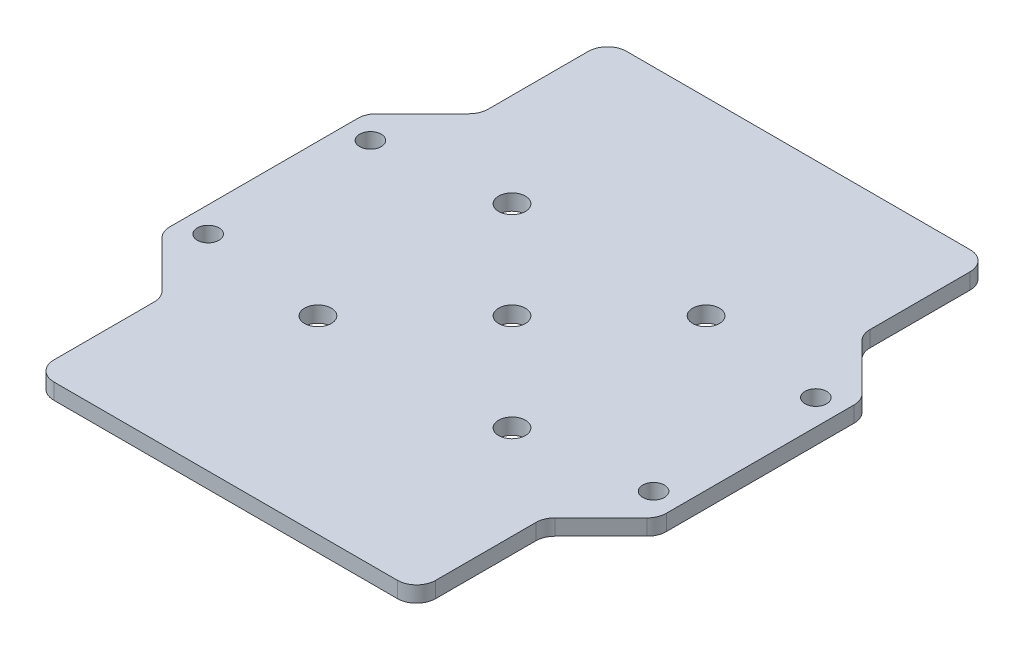
ISO-10303-21;
HEADER;
FILE_DESCRIPTION(('STEP AP214'),'2;1');
FILE_NAME('part.step','',(''),(''),'','','');
FILE_SCHEMA(('AUTOMOTIVE_DESIGN { 1 0 10303 214 1 1 1 1 }'));
ENDSEC;
DATA;
#1=APPLICATION_CONTEXT('core data for automotive mechanical design processes');
#2=APPLICATION_PROTOCOL_DEFINITION('international standard','automotive_design',2000,#1);
#3=PRODUCT_CONTEXT('',#1,'mechanical');
#4=PRODUCT('Part','Part','',(#3));
#5=PRODUCT_RELATED_PRODUCT_CATEGORY('part','',(#4));
#6=PRODUCT_DEFINITION_FORMATION('','',#4);
#7=PRODUCT_DEFINITION_CONTEXT('part definition',#1,'design');
#8=PRODUCT_DEFINITION('design','',#6,#7);
#9=PRODUCT_DEFINITION_SHAPE('','',#8);
#10=(LENGTH_UNIT() NAMED_UNIT(*) SI_UNIT(.MILLI.,.METRE.));
#11=(NAMED_UNIT(*) PLANE_ANGLE_UNIT() SI_UNIT($,.RADIAN.));
#12=(NAMED_UNIT(*) SI_UNIT($,.STERADIAN.) SOLID_ANGLE_UNIT());
#13=UNCERTAINTY_MEASURE_WITH_UNIT(LENGTH_MEASURE(1.E-05),#10,'distance_accuracy_value','');
#14=(GEOMETRIC_REPRESENTATION_CONTEXT(3) GLOBAL_UNCERTAINTY_ASSIGNED_CONTEXT((#13)) GLOBAL_UNIT_ASSIGNED_CONTEXT((#10,
#11,#12)) REPRESENTATION_CONTEXT('',''));
#15=CARTESIAN_POINT('',(0.,0.,0.));
#16=DIRECTION('',(0.,0.,1.));
#17=DIRECTION('',(1.,0.,0.));
#18=AXIS2_PLACEMENT_3D('',#15,#16,#17);
#19=CARTESIAN_POINT('',(30.,1.25,0.));
#20=DIRECTION('',(1.,0.,0.));
#21=DIRECTION('',(0.,0.,-1.));
#22=AXIS2_PLACEMENT_3D('',#19,#20,#21);
#23=PLANE('',#22);
#24=DIRECTION('',(0.,0.,1.));
#25=VECTOR('',#24,1.);
#26=CARTESIAN_POINT('',(30.,1.25,0.));
#27=LINE('',#26,#25);
#28=CARTESIAN_POINT('',(30.,1.25,-42.));
#29=VERTEX_POINT('',#28);
#30=CARTESIAN_POINT('',(30.,1.25,-26.2426406871192));
#31=VERTEX_POINT('',#30);
#32=EDGE_CURVE('E432',#29,#31,#27,.T.);
#33=ORIENTED_EDGE('',*,*,#32,.T.);
#34=DIRECTION('',(0.,-1.,0.));
#35=VECTOR('',#34,1.);
#36=CARTESIAN_POINT('',(30.,1.25,-26.2426406871192));
#37=LINE('',#36,#35);
#38=CARTESIAN_POINT('',(30.,-1.25,-26.2426406871192));
#39=VERTEX_POINT('',#38);
#40=EDGE_CURVE('E310',#31,#39,#37,.T.);
#41=ORIENTED_EDGE('',*,*,#40,.T.);
#42=DIRECTION('',(0.,0.,1.));
#43=VECTOR('',#42,1.);
#44=CARTESIAN_POINT('',(30.,-1.25,0.));
#45=LINE('',#44,#43);
#46=CARTESIAN_POINT('',(30.,-1.25,-42.));
#47=VERTEX_POINT('',#46);
#48=EDGE_CURVE('E444',#47,#39,#45,.T.);
#49=ORIENTED_EDGE('',*,*,#48,.F.);
#50=DIRECTION('',(0.,-1.,0.));
#51=VECTOR('',#50,1.);
#52=CARTESIAN_POINT('',(30.,1.25,-42.));
#53=LINE('',#52,#51);
#54=EDGE_CURVE('E307',#47,#29,#53,.F.);
#55=ORIENTED_EDGE('',*,*,#54,.T.);
#56=EDGE_LOOP('',(#33,#41,#49,#55));
#57=FACE_BOUND('',#56,.T.);
#58=ADVANCED_FACE('F44',(#57),#23,.T.);
#59=CARTESIAN_POINT('',(0.,1.25,-45.));
#60=DIRECTION('',(0.,0.,-1.));
#61=DIRECTION('',(-1.,0.,0.));
#62=AXIS2_PLACEMENT_3D('',#59,#60,#61);
#63=PLANE('',#62);
#64=DIRECTION('',(1.,0.,0.));
#65=VECTOR('',#64,1.);
#66=CARTESIAN_POINT('',(0.,1.25,-45.));
#67=LINE('',#66,#65);
#68=CARTESIAN_POINT('',(-27.,1.25,-45.));
#69=VERTEX_POINT('',#68);
#70=CARTESIAN_POINT('',(27.,1.25,-45.));
#71=VERTEX_POINT('',#70);
#72=EDGE_CURVE('E425',#69,#71,#67,.T.);
#73=ORIENTED_EDGE('',*,*,#72,.T.);
#74=DIRECTION('',(0.,-1.,0.));
#75=VECTOR('',#74,1.);
#76=CARTESIAN_POINT('',(27.,1.25,-45.));
#77=LINE('',#76,#75);
#78=CARTESIAN_POINT('',(27.,-1.25,-45.));
#79=VERTEX_POINT('',#78);
#80=EDGE_CURVE('E352',#71,#79,#77,.T.);
#81=ORIENTED_EDGE('',*,*,#80,.T.);
#82=DIRECTION('',(1.,0.,0.));
#83=VECTOR('',#82,1.);
#84=CARTESIAN_POINT('',(0.,-1.25,-45.));
#85=LINE('',#84,#83);
#86=CARTESIAN_POINT('',(-27.,-1.25,-45.));
#87=VERTEX_POINT('',#86);
#88=EDGE_CURVE('E593',#87,#79,#85,.T.);
#89=ORIENTED_EDGE('',*,*,#88,.F.);
#90=DIRECTION('',(0.,-1.,0.));
#91=VECTOR('',#90,1.);
#92=CARTESIAN_POINT('',(-27.,1.25,-45.));
#93=LINE('',#92,#91);
#94=EDGE_CURVE('E349',#87,#69,#93,.F.);
#95=ORIENTED_EDGE('',*,*,#94,.T.);
#96=EDGE_LOOP('',(#73,#81,#89,#95));
#97=FACE_BOUND('',#96,.T.);
#98=ADVANCED_FACE('F552',(#97),#63,.T.);
#99=CARTESIAN_POINT('',(-30.,1.25,0.));
#100=DIRECTION('',(1.,0.,0.));
#101=DIRECTION('',(0.,0.,-1.));
#102=AXIS2_PLACEMENT_3D('',#99,#100,#101);
#103=PLANE('',#102);
#104=DIRECTION('',(0.,0.,1.));
#105=VECTOR('',#104,1.);
#106=CARTESIAN_POINT('',(-30.,-1.25,0.));
#107=LINE('',#106,#105);
#108=CARTESIAN_POINT('',(-30.,-1.25,-42.));
#109=VERTEX_POINT('',#108);
#110=CARTESIAN_POINT('',(-30.,-1.25,-26.2426406871192));
#111=VERTEX_POINT('',#110);
#112=EDGE_CURVE('E597',#109,#111,#107,.T.);
#113=ORIENTED_EDGE('',*,*,#112,.T.);
#114=DIRECTION('',(0.,-1.,0.));
#115=VECTOR('',#114,1.);
#116=CARTESIAN_POINT('',(-30.,1.25,-26.2426406871192));
#117=LINE('',#116,#115);
#118=CARTESIAN_POINT('',(-30.,1.25,-26.2426406871192));
#119=VERTEX_POINT('',#118);
#120=EDGE_CURVE('E332',#111,#119,#117,.F.);
#121=ORIENTED_EDGE('',*,*,#120,.T.);
#122=DIRECTION('',(0.,0.,1.));
#123=VECTOR('',#122,1.);
#124=CARTESIAN_POINT('',(-30.,1.25,0.));
#125=LINE('',#124,#123);
#126=CARTESIAN_POINT('',(-30.,1.25,-42.));
#127=VERTEX_POINT('',#126);
#128=EDGE_CURVE('E412',#127,#119,#125,.T.);
#129=ORIENTED_EDGE('',*,*,#128,.F.);
#130=DIRECTION('',(0.,-1.,0.));
#131=VECTOR('',#130,1.);
#132=CARTESIAN_POINT('',(-30.,-1.25,-42.));
#133=LINE('',#132,#131);
#134=EDGE_CURVE('E328',#127,#109,#133,.T.);
#135=ORIENTED_EDGE('',*,*,#134,.T.);
#136=EDGE_LOOP('',(#113,#121,#129,#135));
#137=FACE_BOUND('',#136,.T.);
#138=ADVANCED_FACE('F559',(#137),#103,.F.);
#139=CARTESIAN_POINT('',(-27.4999999999998,1.25,-27.5000000000001));
#140=DIRECTION('',(-0.707106781186544,0.,-0.707106781186551));
#141=DIRECTION('',(-0.707106781186551,0.,0.707106781186544));
#142=AXIS2_PLACEMENT_3D('',#139,#140,#141);
#143=PLANE('',#142);
#144=DIRECTION('',(0.707106781186551,0.,-0.707106781186544));
#145=VECTOR('',#144,1.);
#146=CARTESIAN_POINT('',(-27.4999999999998,-1.25,-27.5000000000001));
#147=LINE('',#146,#145);
#148=CARTESIAN_POINT('',(-38.1213203435597,-1.25,-16.8786796564404));
#149=VERTEX_POINT('',#148);
#150=CARTESIAN_POINT('',(-30.8786796564404,-1.25,-24.1213203435596));
#151=VERTEX_POINT('',#150);
#152=EDGE_CURVE('E601',#149,#151,#147,.T.);
#153=ORIENTED_EDGE('',*,*,#152,.F.);
#154=DIRECTION('',(0.,-1.,0.));
#155=VECTOR('',#154,1.);
#156=CARTESIAN_POINT('',(-38.1213203435597,1.25,-16.8786796564404));
#157=LINE('',#156,#155);
#158=CARTESIAN_POINT('',(-38.1213203435597,1.25,-16.8786796564404));
#159=VERTEX_POINT('',#158);
#160=EDGE_CURVE('E325',#149,#159,#157,.F.);
#161=ORIENTED_EDGE('',*,*,#160,.T.);
#162=DIRECTION('',(0.707106781186551,0.,-0.707106781186544));
#163=VECTOR('',#162,1.);
#164=CARTESIAN_POINT('',(-27.4999999999998,1.25,-27.5000000000001));
#165=LINE('',#164,#163);
#166=CARTESIAN_POINT('',(-30.8786796564404,1.25,-24.1213203435596));
#167=VERTEX_POINT('',#166);
#168=EDGE_CURVE('E424',#159,#167,#165,.T.);
#169=ORIENTED_EDGE('',*,*,#168,.T.);
#170=DIRECTION('',(0.,-1.,0.));
#171=VECTOR('',#170,1.);
#172=CARTESIAN_POINT('',(-30.8786796564404,1.25,-24.1213203435596));
#173=LINE('',#172,#171);
#174=EDGE_CURVE('E321',#167,#151,#173,.T.);
#175=ORIENTED_EDGE('',*,*,#174,.T.);
#176=EDGE_LOOP('',(#153,#161,#169,#175));
#177=FACE_BOUND('',#176,.T.);
#178=ADVANCED_FACE('F638',(#177),#143,.T.);
#179=CARTESIAN_POINT('',(-39.,1.25,0.));
#180=DIRECTION('',(-1.,0.,0.));
#181=DIRECTION('',(0.,0.,1.));
#182=AXIS2_PLACEMENT_3D('',#179,#180,#181);
#183=PLANE('',#182);
#184=DIRECTION('',(0.,0.,-1.));
#185=VECTOR('',#184,1.);
#186=CARTESIAN_POINT('',(-39.,1.25,0.));
#187=LINE('',#186,#185);
#188=CARTESIAN_POINT('',(-39.,1.25,14.7573593128807));
#189=VERTEX_POINT('',#188);
#190=CARTESIAN_POINT('',(-39.,1.25,-14.7573593128807));
#191=VERTEX_POINT('',#190);
#192=EDGE_CURVE('E418',#189,#191,#187,.T.);
#193=ORIENTED_EDGE('',*,*,#192,.T.);
#194=DIRECTION('',(0.,-1.,0.));
#195=VECTOR('',#194,1.);
#196=CARTESIAN_POINT('',(-39.,1.25,-14.7573593128807));
#197=LINE('',#196,#195);
#198=CARTESIAN_POINT('',(-39.,-1.25,-14.7573593128807));
#199=VERTEX_POINT('',#198);
#200=EDGE_CURVE('E317',#191,#199,#197,.T.);
#201=ORIENTED_EDGE('',*,*,#200,.T.);
#202=DIRECTION('',(0.,0.,-1.));
#203=VECTOR('',#202,1.);
#204=CARTESIAN_POINT('',(-39.,-1.25,0.));
#205=LINE('',#204,#203);
#206=CARTESIAN_POINT('',(-39.,-1.25,14.7573593128807));
#207=VERTEX_POINT('',#206);
#208=EDGE_CURVE('E396',#207,#199,#205,.T.);
#209=ORIENTED_EDGE('',*,*,#208,.F.);
#210=DIRECTION('',(0.,-1.,0.));
#211=VECTOR('',#210,1.);
#212=CARTESIAN_POINT('',(-39.,1.25,14.7573593128807));
#213=LINE('',#212,#211);
#214=EDGE_CURVE('E314',#207,#189,#213,.F.);
#215=ORIENTED_EDGE('',*,*,#214,.T.);
#216=EDGE_LOOP('',(#193,#201,#209,#215));
#217=FACE_BOUND('',#216,.T.);
#218=ADVANCED_FACE('F649',(#217),#183,.T.);
#219=CARTESIAN_POINT('',(-27.4999999999998,1.25,27.5000000000001));
#220=DIRECTION('',(0.707106781186544,0.,-0.707106781186551));
#221=DIRECTION('',(-0.707106781186551,0.,-0.707106781186544));
#222=AXIS2_PLACEMENT_3D('',#219,#220,#221);
#223=PLANE('',#222);
#224=DIRECTION('',(0.707106781186551,0.,0.707106781186544));
#225=VECTOR('',#224,1.);
#226=CARTESIAN_POINT('',(-27.4999999999998,1.25,27.5000000000001));
#227=LINE('',#226,#225);
#228=CARTESIAN_POINT('',(-38.1213203435596,1.25,16.8786796564404));
#229=VERTEX_POINT('',#228);
#230=CARTESIAN_POINT('',(-30.8786796564404,1.25,24.1213203435596));
#231=VERTEX_POINT('',#230);
#232=EDGE_CURVE('E405',#229,#231,#227,.T.);
#233=ORIENTED_EDGE('',*,*,#232,.F.);
#234=DIRECTION('',(0.,-1.,0.));
#235=VECTOR('',#234,1.);
#236=CARTESIAN_POINT('',(-38.1213203435596,-1.25,16.8786796564404));
#237=LINE('',#236,#235);
#238=CARTESIAN_POINT('',(-38.1213203435596,-1.25,16.8786796564404));
#239=VERTEX_POINT('',#238);
#240=EDGE_CURVE('E338',#229,#239,#237,.T.);
#241=ORIENTED_EDGE('',*,*,#240,.T.);
#242=DIRECTION('',(0.707106781186551,0.,0.707106781186544));
#243=VECTOR('',#242,1.);
#244=CARTESIAN_POINT('',(-27.4999999999998,-1.25,27.5000000000001));
#245=LINE('',#244,#243);
#246=CARTESIAN_POINT('',(-30.8786796564404,-1.25,24.1213203435596));
#247=VERTEX_POINT('',#246);
#248=EDGE_CURVE('E384',#239,#247,#245,.T.);
#249=ORIENTED_EDGE('',*,*,#248,.T.);
#250=DIRECTION('',(0.,-1.,0.));
#251=VECTOR('',#250,1.);
#252=CARTESIAN_POINT('',(-30.8786796564404,1.25,24.1213203435596));
#253=LINE('',#252,#251);
#254=EDGE_CURVE('E335',#247,#231,#253,.F.);
#255=ORIENTED_EDGE('',*,*,#254,.T.);
#256=EDGE_LOOP('',(#233,#241,#249,#255));
#257=FACE_BOUND('',#256,.T.);
#258=ADVANCED_FACE('F392',(#257),#223,.F.);
#259=CARTESIAN_POINT('',(-30.,1.25,26.2426406871192));
#260=VERTEX_POINT('',#259);
#261=CARTESIAN_POINT('',(-30.,1.25,42.));
#262=VERTEX_POINT('',#261);
#263=EDGE_CURVE('E403',#260,#262,#125,.T.);
#264=ORIENTED_EDGE('',*,*,#263,.F.);
#265=DIRECTION('',(0.,-1.,0.));
#266=VECTOR('',#265,1.);
#267=CARTESIAN_POINT('',(-30.,-1.25,26.2426406871192));
#268=LINE('',#267,#266);
#269=CARTESIAN_POINT('',(-30.,-1.25,26.2426406871192));
#270=VERTEX_POINT('',#269);
#271=EDGE_CURVE('E345',#260,#270,#268,.T.);
#272=ORIENTED_EDGE('',*,*,#271,.T.);
#273=CARTESIAN_POINT('',(-30.,-1.25,42.));
#274=VERTEX_POINT('',#273);
#275=EDGE_CURVE('E386',#270,#274,#107,.T.);
#276=ORIENTED_EDGE('',*,*,#275,.T.);
#277=DIRECTION('',(0.,-1.,0.));
#278=VECTOR('',#277,1.);
#279=CARTESIAN_POINT('',(-30.,1.25,42.));
#280=LINE('',#279,#278);
#281=EDGE_CURVE('E342',#274,#262,#280,.F.);
#282=ORIENTED_EDGE('',*,*,#281,.T.);
#283=EDGE_LOOP('',(#264,#272,#276,#282));
#284=FACE_BOUND('',#283,.T.);
#285=ADVANCED_FACE('F407',(#284),#103,.F.);
#286=CARTESIAN_POINT('',(0.,1.25,45.));
#287=DIRECTION('',(0.,0.,-1.));
#288=DIRECTION('',(-1.,0.,0.));
#289=AXIS2_PLACEMENT_3D('',#286,#287,#288);
#290=PLANE('',#289);
#291=DIRECTION('',(1.,0.,0.));
#292=VECTOR('',#291,1.);
#293=CARTESIAN_POINT('',(0.,-1.25,45.));
#294=LINE('',#293,#292);
#295=CARTESIAN_POINT('',(-27.,-1.25,45.));
#296=VERTEX_POINT('',#295);
#297=CARTESIAN_POINT('',(27.,-1.25,45.));
#298=VERTEX_POINT('',#297);
#299=EDGE_CURVE('E579',#296,#298,#294,.T.);
#300=ORIENTED_EDGE('',*,*,#299,.T.);
#301=DIRECTION('',(0.,-1.,0.));
#302=VECTOR('',#301,1.);
#303=CARTESIAN_POINT('',(27.,1.25,45.));
#304=LINE('',#303,#302);
#305=CARTESIAN_POINT('',(27.,1.25,45.));
#306=VERTEX_POINT('',#305);
#307=EDGE_CURVE('E360',#298,#306,#304,.F.);
#308=ORIENTED_EDGE('',*,*,#307,.T.);
#309=DIRECTION('',(1.,0.,0.));
#310=VECTOR('',#309,1.);
#311=CARTESIAN_POINT('',(0.,1.25,45.));
#312=LINE('',#311,#310);
#313=CARTESIAN_POINT('',(-27.,1.25,45.));
#314=VERTEX_POINT('',#313);
#315=EDGE_CURVE('E410',#314,#306,#312,.T.);
#316=ORIENTED_EDGE('',*,*,#315,.F.);
#317=DIRECTION('',(0.,-1.,0.));
#318=VECTOR('',#317,1.);
#319=CARTESIAN_POINT('',(-27.,1.25,45.));
#320=LINE('',#319,#318);
#321=EDGE_CURVE('E356',#314,#296,#320,.T.);
#322=ORIENTED_EDGE('',*,*,#321,.T.);
#323=EDGE_LOOP('',(#300,#308,#316,#322));
#324=FACE_BOUND('',#323,.T.);
#325=ADVANCED_FACE('F564',(#324),#290,.F.);
#326=CARTESIAN_POINT('',(30.,-1.25,26.2426406871192));
#327=VERTEX_POINT('',#326);
#328=CARTESIAN_POINT('',(30.,-1.25,42.));
#329=VERTEX_POINT('',#328);
#330=EDGE_CURVE('E230',#327,#329,#45,.T.);
#331=ORIENTED_EDGE('',*,*,#330,.F.);
#332=DIRECTION('',(0.,-1.,0.));
#333=VECTOR('',#332,1.);
#334=CARTESIAN_POINT('',(30.,1.25,26.2426406871192));
#335=LINE('',#334,#333);
#336=CARTESIAN_POINT('',(30.,1.25,26.2426406871192));
#337=VERTEX_POINT('',#336);
#338=EDGE_CURVE('E251',#327,#337,#335,.F.);
#339=ORIENTED_EDGE('',*,*,#338,.T.);
#340=CARTESIAN_POINT('',(30.,1.25,42.));
#341=VERTEX_POINT('',#340);
#342=EDGE_CURVE('E416',#337,#341,#27,.T.);
#343=ORIENTED_EDGE('',*,*,#342,.T.);
#344=DIRECTION('',(0.,-1.,0.));
#345=VECTOR('',#344,1.);
#346=CARTESIAN_POINT('',(30.,-1.25,42.));
#347=LINE('',#346,#345);
#348=EDGE_CURVE('E240',#341,#329,#347,.T.);
#349=ORIENTED_EDGE('',*,*,#348,.T.);
#350=EDGE_LOOP('',(#331,#339,#343,#349));
#351=FACE_BOUND('',#350,.T.);
#352=ADVANCED_FACE('F555',(#351),#23,.T.);
#353=CARTESIAN_POINT('',(27.4999999999998,1.25,27.5000000000001));
#354=DIRECTION('',(0.707106781186544,0.,0.707106781186551));
#355=DIRECTION('',(0.707106781186551,0.,-0.707106781186544));
#356=AXIS2_PLACEMENT_3D('',#353,#354,#355);
#357=PLANE('',#356);
#358=DIRECTION('',(-0.707106781186551,0.,0.707106781186544));
#359=VECTOR('',#358,1.);
#360=CARTESIAN_POINT('',(27.4999999999998,1.25,27.5000000000001));
#361=LINE('',#360,#359);
#362=CARTESIAN_POINT('',(38.1213203435597,1.25,16.8786796564404));
#363=VERTEX_POINT('',#362);
#364=CARTESIAN_POINT('',(30.8786796564404,1.25,24.1213203435596));
#365=VERTEX_POINT('',#364);
#366=EDGE_CURVE('E584',#363,#365,#361,.T.);
#367=ORIENTED_EDGE('',*,*,#366,.T.);
#368=DIRECTION('',(0.,-1.,0.));
#369=VECTOR('',#368,1.);
#370=CARTESIAN_POINT('',(30.8786796564404,-1.25,24.1213203435596));
#371=LINE('',#370,#369);
#372=CARTESIAN_POINT('',(30.8786796564404,-1.25,24.1213203435596));
#373=VERTEX_POINT('',#372);
#374=EDGE_CURVE('E228',#365,#373,#371,.T.);
#375=ORIENTED_EDGE('',*,*,#374,.T.);
#376=DIRECTION('',(-0.707106781186551,0.,0.707106781186544));
#377=VECTOR('',#376,1.);
#378=CARTESIAN_POINT('',(27.4999999999998,-1.25,27.5000000000001));
#379=LINE('',#378,#377);
#380=CARTESIAN_POINT('',(38.1213203435597,-1.25,16.8786796564404));
#381=VERTEX_POINT('',#380);
#382=EDGE_CURVE('E210',#381,#373,#379,.T.);
#383=ORIENTED_EDGE('',*,*,#382,.F.);
#384=DIRECTION('',(0.,-1.,0.));
#385=VECTOR('',#384,1.);
#386=CARTESIAN_POINT('',(38.1213203435597,1.25,16.8786796564404));
#387=LINE('',#386,#385);
#388=EDGE_CURVE('E225',#381,#363,#387,.F.);
#389=ORIENTED_EDGE('',*,*,#388,.T.);
#390=EDGE_LOOP('',(#367,#375,#383,#389));
#391=FACE_BOUND('',#390,.T.);
#392=ADVANCED_FACE('F224',(#391),#357,.T.);
#393=CARTESIAN_POINT('',(39.,1.25,0.));
#394=DIRECTION('',(-1.,0.,0.));
#395=DIRECTION('',(0.,0.,1.));
#396=AXIS2_PLACEMENT_3D('',#393,#394,#395);
#397=PLANE('',#396);
#398=DIRECTION('',(0.,0.,-1.));
#399=VECTOR('',#398,1.);
#400=CARTESIAN_POINT('',(39.,1.25,0.));
#401=LINE('',#400,#399);
#402=CARTESIAN_POINT('',(39.,1.25,14.7573593128807));
#403=VERTEX_POINT('',#402);
#404=CARTESIAN_POINT('',(39.,1.25,-14.7573593128807));
#405=VERTEX_POINT('',#404);
#406=EDGE_CURVE('E242',#403,#405,#401,.T.);
#407=ORIENTED_EDGE('',*,*,#406,.F.);
#408=DIRECTION('',(0.,-1.,0.));
#409=VECTOR('',#408,1.);
#410=CARTESIAN_POINT('',(39.,-1.25,14.7573593128807));
#411=LINE('',#410,#409);
#412=CARTESIAN_POINT('',(39.,-1.25,14.7573593128807));
#413=VERTEX_POINT('',#412);
#414=EDGE_CURVE('E257',#403,#413,#411,.T.);
#415=ORIENTED_EDGE('',*,*,#414,.T.);
#416=DIRECTION('',(0.,0.,-1.));
#417=VECTOR('',#416,1.);
#418=CARTESIAN_POINT('',(39.,-1.25,0.));
#419=LINE('',#418,#417);
#420=CARTESIAN_POINT('',(39.,-1.25,-14.7573593128807));
#421=VERTEX_POINT('',#420);
#422=EDGE_CURVE('E212',#413,#421,#419,.T.);
#423=ORIENTED_EDGE('',*,*,#422,.T.);
#424=DIRECTION('',(0.,-1.,0.));
#425=VECTOR('',#424,1.);
#426=CARTESIAN_POINT('',(39.,1.25,-14.7573593128807));
#427=LINE('',#426,#425);
#428=EDGE_CURVE('E254',#421,#405,#427,.F.);
#429=ORIENTED_EDGE('',*,*,#428,.T.);
#430=EDGE_LOOP('',(#407,#415,#423,#429));
#431=FACE_BOUND('',#430,.T.);
#432=ADVANCED_FACE('F570',(#431),#397,.F.);
#433=CARTESIAN_POINT('',(27.4999999999998,1.25,-27.5000000000001));
#434=DIRECTION('',(-0.707106781186544,0.,0.707106781186551));
#435=DIRECTION('',(0.707106781186551,0.,0.707106781186544));
#436=AXIS2_PLACEMENT_3D('',#433,#434,#435);
#437=PLANE('',#436);
#438=DIRECTION('',(-0.707106781186551,0.,-0.707106781186544));
#439=VECTOR('',#438,1.);
#440=CARTESIAN_POINT('',(27.4999999999998,1.25,-27.5000000000001));
#441=LINE('',#440,#439);
#442=CARTESIAN_POINT('',(38.1213203435597,1.25,-16.8786796564404));
#443=VERTEX_POINT('',#442);
#444=CARTESIAN_POINT('',(30.8786796564404,1.25,-24.1213203435596));
#445=VERTEX_POINT('',#444);
#446=EDGE_CURVE('E236',#443,#445,#441,.T.);
#447=ORIENTED_EDGE('',*,*,#446,.F.);
#448=DIRECTION('',(0.,-1.,0.));
#449=VECTOR('',#448,1.);
#450=CARTESIAN_POINT('',(38.1213203435597,1.25,-16.8786796564404));
#451=LINE('',#450,#449);
#452=CARTESIAN_POINT('',(38.1213203435597,-1.25,-16.8786796564404));
#453=VERTEX_POINT('',#452);
#454=EDGE_CURVE('E303',#443,#453,#451,.T.);
#455=ORIENTED_EDGE('',*,*,#454,.T.);
#456=DIRECTION('',(-0.707106781186551,0.,-0.707106781186544));
#457=VECTOR('',#456,1.);
#458=CARTESIAN_POINT('',(27.4999999999998,-1.25,-27.5000000000001));
#459=LINE('',#458,#457);
#460=CARTESIAN_POINT('',(30.8786796564404,-1.25,-24.1213203435596));
#461=VERTEX_POINT('',#460);
#462=EDGE_CURVE('E245',#453,#461,#459,.T.);
#463=ORIENTED_EDGE('',*,*,#462,.T.);
#464=DIRECTION('',(0.,-1.,0.));
#465=VECTOR('',#464,1.);
#466=CARTESIAN_POINT('',(30.8786796564404,1.25,-24.1213203435596));
#467=LINE('',#466,#465);
#468=EDGE_CURVE('E60',#461,#445,#467,.F.);
#469=ORIENTED_EDGE('',*,*,#468,.T.);
#470=EDGE_LOOP('',(#447,#455,#463,#469));
#471=FACE_BOUND('',#470,.T.);
#472=ADVANCED_FACE('F518',(#471),#437,.F.);
#473=CARTESIAN_POINT('',(0.,1.25,0.));
#474=DIRECTION('',(0.,1.,0.));
#475=DIRECTION('',(0.,0.,1.));
#476=AXIS2_PLACEMENT_3D('',#473,#474,#475);
#477=PLANE('',#476);
#478=CARTESIAN_POINT('',(35.,1.25,-12.75));
#479=DIRECTION('',(0.,1.,0.));
#480=DIRECTION('',(0.,0.,1.));
#481=AXIS2_PLACEMENT_3D('',#478,#479,#480);
#482=CIRCLE('',#481,1.69999999999999);
#483=CARTESIAN_POINT('',(35.,1.25,-11.05));
#484=VERTEX_POINT('',#483);
#485=EDGE_CURVE('E509',#484,#484,#482,.T.);
#486=ORIENTED_EDGE('',*,*,#485,.F.);
#487=EDGE_LOOP('',(#486));
#488=FACE_BOUND('',#487,.T.);
#489=CARTESIAN_POINT('',(35.,1.25,12.75));
#490=DIRECTION('',(0.,1.,0.));
#491=DIRECTION('',(0.,0.,1.));
#492=AXIS2_PLACEMENT_3D('',#489,#490,#491);
#493=CIRCLE('',#492,1.69999999999999);
#494=CARTESIAN_POINT('',(35.,1.25,14.45));
#495=VERTEX_POINT('',#494);
#496=EDGE_CURVE('E501',#495,#495,#493,.T.);
#497=ORIENTED_EDGE('',*,*,#496,.F.);
#498=EDGE_LOOP('',(#497));
#499=FACE_BOUND('',#498,.T.);
#500=CARTESIAN_POINT('',(-35.,1.25,12.75));
#501=DIRECTION('',(0.,1.,0.));
#502=DIRECTION('',(0.,0.,1.));
#503=AXIS2_PLACEMENT_3D('',#500,#501,#502);
#504=CIRCLE('',#503,1.69999999999999);
#505=CARTESIAN_POINT('',(-35.,1.25,14.45));
#506=VERTEX_POINT('',#505);
#507=EDGE_CURVE('E493',#506,#506,#504,.T.);
#508=ORIENTED_EDGE('',*,*,#507,.F.);
#509=EDGE_LOOP('',(#508));
#510=FACE_BOUND('',#509,.T.);
#511=CARTESIAN_POINT('',(-35.,1.25,-12.75));
#512=DIRECTION('',(0.,1.,0.));
#513=DIRECTION('',(0.,0.,1.));
#514=AXIS2_PLACEMENT_3D('',#511,#512,#513);
#515=CIRCLE('',#514,1.69999999999999);
#516=CARTESIAN_POINT('',(-35.,1.25,-11.05));
#517=VERTEX_POINT('',#516);
#518=EDGE_CURVE('E485',#517,#517,#515,.T.);
#519=ORIENTED_EDGE('',*,*,#518,.F.);
#520=EDGE_LOOP('',(#519));
#521=FACE_BOUND('',#520,.T.);
#522=CARTESIAN_POINT('',(0.,1.25,0.));
#523=DIRECTION('',(0.,1.,0.));
#524=DIRECTION('',(0.,0.,1.));
#525=AXIS2_PLACEMENT_3D('',#522,#523,#524);
#526=CIRCLE('',#525,2.1);
#527=CARTESIAN_POINT('',(0.,1.25,2.1));
#528=VERTEX_POINT('',#527);
#529=EDGE_CURVE('E477',#528,#528,#526,.T.);
#530=ORIENTED_EDGE('',*,*,#529,.F.);
#531=EDGE_LOOP('',(#530));
#532=FACE_BOUND('',#531,.T.);
#533=CARTESIAN_POINT('',(15.25,1.25,15.25));
#534=DIRECTION('',(0.,1.,0.));
#535=DIRECTION('',(0.,0.,1.));
#536=AXIS2_PLACEMENT_3D('',#533,#534,#535);
#537=CIRCLE('',#536,2.1);
#538=CARTESIAN_POINT('',(15.25,1.25,17.35));
#539=VERTEX_POINT('',#538);
#540=EDGE_CURVE('E469',#539,#539,#537,.T.);
#541=ORIENTED_EDGE('',*,*,#540,.F.);
#542=EDGE_LOOP('',(#541));
#543=FACE_BOUND('',#542,.T.);
#544=CARTESIAN_POINT('',(-15.25,1.25,-15.25));
#545=DIRECTION('',(0.,1.,0.));
#546=DIRECTION('',(0.,0.,1.));
#547=AXIS2_PLACEMENT_3D('',#544,#545,#546);
#548=CIRCLE('',#547,2.1);
#549=CARTESIAN_POINT('',(-15.25,1.25,-13.15));
#550=VERTEX_POINT('',#549);
#551=EDGE_CURVE('E461',#550,#550,#548,.T.);
#552=ORIENTED_EDGE('',*,*,#551,.F.);
#553=EDGE_LOOP('',(#552));
#554=FACE_BOUND('',#553,.T.);
#555=CARTESIAN_POINT('',(-15.25,1.25,15.25));
#556=DIRECTION('',(0.,1.,0.));
#557=DIRECTION('',(0.,0.,1.));
#558=AXIS2_PLACEMENT_3D('',#555,#556,#557);
#559=CIRCLE('',#558,2.1);
#560=CARTESIAN_POINT('',(-15.25,1.25,17.35));
#561=VERTEX_POINT('',#560);
#562=EDGE_CURVE('E453',#561,#561,#559,.T.);
#563=ORIENTED_EDGE('',*,*,#562,.F.);
#564=EDGE_LOOP('',(#563));
#565=FACE_BOUND('',#564,.T.);
#566=CARTESIAN_POINT('',(15.25,1.25,-15.25));
#567=DIRECTION('',(0.,1.,0.));
#568=DIRECTION('',(0.,0.,1.));
#569=AXIS2_PLACEMENT_3D('',#566,#567,#568);
#570=CIRCLE('',#569,2.1);
#571=CARTESIAN_POINT('',(15.25,1.25,-13.15));
#572=VERTEX_POINT('',#571);
#573=EDGE_CURVE('E445',#572,#572,#570,.T.);
#574=ORIENTED_EDGE('',*,*,#573,.F.);
#575=EDGE_LOOP('',(#574));
#576=FACE_BOUND('',#575,.T.);
#577=ORIENTED_EDGE('',*,*,#366,.F.);
#578=CARTESIAN_POINT('',(36.,1.25,14.7573593128807));
#579=DIRECTION('',(0.,1.,0.));
#580=DIRECTION('',(0.,0.,1.));
#581=AXIS2_PLACEMENT_3D('',#578,#579,#580);
#582=CIRCLE('',#581,3.);
#583=EDGE_CURVE('E234',#363,#403,#582,.T.);
#584=ORIENTED_EDGE('',*,*,#583,.T.);
#585=ORIENTED_EDGE('',*,*,#406,.T.);
#586=CARTESIAN_POINT('',(36.,1.25,-14.7573593128807));
#587=DIRECTION('',(0.,1.,0.));
#588=DIRECTION('',(0.,0.,1.));
#589=AXIS2_PLACEMENT_3D('',#586,#587,#588);
#590=CIRCLE('',#589,3.);
#591=EDGE_CURVE('E67',#405,#443,#590,.T.);
#592=ORIENTED_EDGE('',*,*,#591,.T.);
#593=ORIENTED_EDGE('',*,*,#446,.T.);
#594=CARTESIAN_POINT('',(33.,1.25,-26.2426406871192));
#595=DIRECTION('',(0.,1.,0.));
#596=DIRECTION('',(0.,0.,1.));
#597=AXIS2_PLACEMENT_3D('',#594,#595,#596);
#598=CIRCLE('',#597,3.);
#599=EDGE_CURVE('E372',#445,#31,#598,.F.);
#600=ORIENTED_EDGE('',*,*,#599,.T.);
#601=ORIENTED_EDGE('',*,*,#32,.F.);
#602=CARTESIAN_POINT('',(27.,1.25,-42.));
#603=DIRECTION('',(0.,1.,0.));
#604=DIRECTION('',(0.,0.,1.));
#605=AXIS2_PLACEMENT_3D('',#602,#603,#604);
#606=CIRCLE('',#605,3.);
#607=EDGE_CURVE('E288',#29,#71,#606,.T.);
#608=ORIENTED_EDGE('',*,*,#607,.T.);
#609=ORIENTED_EDGE('',*,*,#72,.F.);
#610=CARTESIAN_POINT('',(-27.,1.25,-42.));
#611=DIRECTION('',(0.,1.,0.));
#612=DIRECTION('',(0.,0.,1.));
#613=AXIS2_PLACEMENT_3D('',#610,#611,#612);
#614=CIRCLE('',#613,3.);
#615=EDGE_CURVE('E218',#69,#127,#614,.T.);
#616=ORIENTED_EDGE('',*,*,#615,.T.);
#617=ORIENTED_EDGE('',*,*,#128,.T.);
#618=CARTESIAN_POINT('',(-33.,1.25,-26.2426406871192));
#619=DIRECTION('',(0.,1.,0.));
#620=DIRECTION('',(0.,0.,1.));
#621=AXIS2_PLACEMENT_3D('',#618,#619,#620);
#622=CIRCLE('',#621,3.);
#623=EDGE_CURVE('E378',#119,#167,#622,.F.);
#624=ORIENTED_EDGE('',*,*,#623,.T.);
#625=ORIENTED_EDGE('',*,*,#168,.F.);
#626=CARTESIAN_POINT('',(-36.,1.25,-14.7573593128807));
#627=DIRECTION('',(0.,1.,0.));
#628=DIRECTION('',(0.,0.,1.));
#629=AXIS2_PLACEMENT_3D('',#626,#627,#628);
#630=CIRCLE('',#629,3.);
#631=EDGE_CURVE('E294',#159,#191,#630,.T.);
#632=ORIENTED_EDGE('',*,*,#631,.T.);
#633=ORIENTED_EDGE('',*,*,#192,.F.);
#634=CARTESIAN_POINT('',(-36.,1.25,14.7573593128807));
#635=DIRECTION('',(0.,1.,0.));
#636=DIRECTION('',(0.,0.,1.));
#637=AXIS2_PLACEMENT_3D('',#634,#635,#636);
#638=CIRCLE('',#637,3.);
#639=EDGE_CURVE('E291',#189,#229,#638,.T.);
#640=ORIENTED_EDGE('',*,*,#639,.T.);
#641=ORIENTED_EDGE('',*,*,#232,.T.);
#642=CARTESIAN_POINT('',(-33.,1.25,26.2426406871192));
#643=DIRECTION('',(0.,1.,0.));
#644=DIRECTION('',(0.,0.,1.));
#645=AXIS2_PLACEMENT_3D('',#642,#643,#644);
#646=CIRCLE('',#645,3.);
#647=EDGE_CURVE('E11',#231,#260,#646,.F.);
#648=ORIENTED_EDGE('',*,*,#647,.T.);
#649=ORIENTED_EDGE('',*,*,#263,.T.);
#650=CARTESIAN_POINT('',(-27.,1.25,42.));
#651=DIRECTION('',(0.,1.,0.));
#652=DIRECTION('',(0.,0.,1.));
#653=AXIS2_PLACEMENT_3D('',#650,#651,#652);
#654=CIRCLE('',#653,3.);
#655=EDGE_CURVE('E282',#262,#314,#654,.T.);
#656=ORIENTED_EDGE('',*,*,#655,.T.);
#657=ORIENTED_EDGE('',*,*,#315,.T.);
#658=CARTESIAN_POINT('',(27.,1.25,42.));
#659=DIRECTION('',(0.,1.,0.));
#660=DIRECTION('',(0.,0.,1.));
#661=AXIS2_PLACEMENT_3D('',#658,#659,#660);
#662=CIRCLE('',#661,3.);
#663=EDGE_CURVE('E285',#306,#341,#662,.T.);
#664=ORIENTED_EDGE('',*,*,#663,.T.);
#665=ORIENTED_EDGE('',*,*,#342,.F.);
#666=CARTESIAN_POINT('',(33.,1.25,26.2426406871192));
#667=DIRECTION('',(0.,1.,0.));
#668=DIRECTION('',(0.,0.,1.));
#669=AXIS2_PLACEMENT_3D('',#666,#667,#668);
#670=CIRCLE('',#669,3.);
#671=EDGE_CURVE('E366',#337,#365,#670,.F.);
#672=ORIENTED_EDGE('',*,*,#671,.T.);
#673=EDGE_LOOP('',(#577,#584,#585,#592,#593,#600,#601,#608,#609,#616,#617,#624,#625,#632,#633,
#640,#641,#648,#649,#656,#657,#664,#665,#672));
#674=FACE_BOUND('',#673,.T.);
#675=ADVANCED_FACE('F402',(#488,#499,#510,#521,#532,#543,#554,#565,#576,#674),#477,.T.);
#676=CARTESIAN_POINT('',(0.,-1.25,0.));
#677=DIRECTION('',(0.,1.,0.));
#678=DIRECTION('',(0.,0.,1.));
#679=AXIS2_PLACEMENT_3D('',#676,#677,#678);
#680=PLANE('',#679);
#681=CARTESIAN_POINT('',(35.,-1.25,-12.75));
#682=DIRECTION('',(0.,1.,0.));
#683=DIRECTION('',(0.,0.,1.));
#684=AXIS2_PLACEMENT_3D('',#681,#682,#683);
#685=CIRCLE('',#684,1.7);
#686=CARTESIAN_POINT('',(35.,-1.25,-11.05));
#687=VERTEX_POINT('',#686);
#688=EDGE_CURVE('E505',#687,#687,#685,.T.);
#689=ORIENTED_EDGE('',*,*,#688,.T.);
#690=EDGE_LOOP('',(#689));
#691=FACE_BOUND('',#690,.T.);
#692=CARTESIAN_POINT('',(35.,-1.25,12.75));
#693=DIRECTION('',(0.,1.,0.));
#694=DIRECTION('',(0.,0.,1.));
#695=AXIS2_PLACEMENT_3D('',#692,#693,#694);
#696=CIRCLE('',#695,1.7);
#697=CARTESIAN_POINT('',(35.,-1.25,14.45));
#698=VERTEX_POINT('',#697);
#699=EDGE_CURVE('E497',#698,#698,#696,.T.);
#700=ORIENTED_EDGE('',*,*,#699,.T.);
#701=EDGE_LOOP('',(#700));
#702=FACE_BOUND('',#701,.T.);
#703=CARTESIAN_POINT('',(-35.,-1.25,12.75));
#704=DIRECTION('',(0.,1.,0.));
#705=DIRECTION('',(0.,0.,1.));
#706=AXIS2_PLACEMENT_3D('',#703,#704,#705);
#707=CIRCLE('',#706,1.7);
#708=CARTESIAN_POINT('',(-35.,-1.25,14.45));
#709=VERTEX_POINT('',#708);
#710=EDGE_CURVE('E489',#709,#709,#707,.T.);
#711=ORIENTED_EDGE('',*,*,#710,.T.);
#712=EDGE_LOOP('',(#711));
#713=FACE_BOUND('',#712,.T.);
#714=CARTESIAN_POINT('',(-35.,-1.25,-12.75));
#715=DIRECTION('',(0.,1.,0.));
#716=DIRECTION('',(0.,0.,1.));
#717=AXIS2_PLACEMENT_3D('',#714,#715,#716);
#718=CIRCLE('',#717,1.7);
#719=CARTESIAN_POINT('',(-35.,-1.25,-11.05));
#720=VERTEX_POINT('',#719);
#721=EDGE_CURVE('E481',#720,#720,#718,.T.);
#722=ORIENTED_EDGE('',*,*,#721,.T.);
#723=EDGE_LOOP('',(#722));
#724=FACE_BOUND('',#723,.T.);
#725=CARTESIAN_POINT('',(0.,-1.25,0.));
#726=DIRECTION('',(0.,1.,0.));
#727=DIRECTION('',(0.,0.,1.));
#728=AXIS2_PLACEMENT_3D('',#725,#726,#727);
#729=CIRCLE('',#728,2.1);
#730=CARTESIAN_POINT('',(0.,-1.25,2.1));
#731=VERTEX_POINT('',#730);
#732=EDGE_CURVE('E473',#731,#731,#729,.T.);
#733=ORIENTED_EDGE('',*,*,#732,.T.);
#734=EDGE_LOOP('',(#733));
#735=FACE_BOUND('',#734,.T.);
#736=CARTESIAN_POINT('',(15.25,-1.25,15.25));
#737=DIRECTION('',(0.,1.,0.));
#738=DIRECTION('',(0.,0.,1.));
#739=AXIS2_PLACEMENT_3D('',#736,#737,#738);
#740=CIRCLE('',#739,2.1);
#741=CARTESIAN_POINT('',(15.25,-1.25,17.35));
#742=VERTEX_POINT('',#741);
#743=EDGE_CURVE('E465',#742,#742,#740,.T.);
#744=ORIENTED_EDGE('',*,*,#743,.T.);
#745=EDGE_LOOP('',(#744));
#746=FACE_BOUND('',#745,.T.);
#747=CARTESIAN_POINT('',(-15.25,-1.25,-15.25));
#748=DIRECTION('',(0.,1.,0.));
#749=DIRECTION('',(0.,0.,1.));
#750=AXIS2_PLACEMENT_3D('',#747,#748,#749);
#751=CIRCLE('',#750,2.1);
#752=CARTESIAN_POINT('',(-15.25,-1.25,-13.15));
#753=VERTEX_POINT('',#752);
#754=EDGE_CURVE('E457',#753,#753,#751,.T.);
#755=ORIENTED_EDGE('',*,*,#754,.T.);
#756=EDGE_LOOP('',(#755));
#757=FACE_BOUND('',#756,.T.);
#758=CARTESIAN_POINT('',(-15.25,-1.25,15.25));
#759=DIRECTION('',(0.,1.,0.));
#760=DIRECTION('',(0.,0.,1.));
#761=AXIS2_PLACEMENT_3D('',#758,#759,#760);
#762=CIRCLE('',#761,2.1);
#763=CARTESIAN_POINT('',(-15.25,-1.25,17.35));
#764=VERTEX_POINT('',#763);
#765=EDGE_CURVE('E449',#764,#764,#762,.T.);
#766=ORIENTED_EDGE('',*,*,#765,.T.);
#767=EDGE_LOOP('',(#766));
#768=FACE_BOUND('',#767,.T.);
#769=CARTESIAN_POINT('',(15.25,-1.25,-15.25));
#770=DIRECTION('',(0.,1.,0.));
#771=DIRECTION('',(0.,0.,1.));
#772=AXIS2_PLACEMENT_3D('',#769,#770,#771);
#773=CIRCLE('',#772,2.1);
#774=CARTESIAN_POINT('',(15.25,-1.25,-13.15));
#775=VERTEX_POINT('',#774);
#776=EDGE_CURVE('E440',#775,#775,#773,.T.);
#777=ORIENTED_EDGE('',*,*,#776,.T.);
#778=EDGE_LOOP('',(#777));
#779=FACE_BOUND('',#778,.T.);
#780=ORIENTED_EDGE('',*,*,#422,.F.);
#781=CARTESIAN_POINT('',(36.,-1.25,14.7573593128807));
#782=DIRECTION('',(0.,1.,0.));
#783=DIRECTION('',(0.,0.,1.));
#784=AXIS2_PLACEMENT_3D('',#781,#782,#783);
#785=CIRCLE('',#784,3.);
#786=EDGE_CURVE('E207',#413,#381,#785,.F.);
#787=ORIENTED_EDGE('',*,*,#786,.T.);
#788=ORIENTED_EDGE('',*,*,#382,.T.);
#789=CARTESIAN_POINT('',(33.,-1.25,26.2426406871192));
#790=DIRECTION('',(0.,1.,0.));
#791=DIRECTION('',(0.,0.,1.));
#792=AXIS2_PLACEMENT_3D('',#789,#790,#791);
#793=CIRCLE('',#792,3.);
#794=EDGE_CURVE('E363',#373,#327,#793,.T.);
#795=ORIENTED_EDGE('',*,*,#794,.T.);
#796=ORIENTED_EDGE('',*,*,#330,.T.);
#797=CARTESIAN_POINT('',(27.,-1.25,42.));
#798=DIRECTION('',(0.,1.,0.));
#799=DIRECTION('',(0.,0.,1.));
#800=AXIS2_PLACEMENT_3D('',#797,#798,#799);
#801=CIRCLE('',#800,3.);
#802=EDGE_CURVE('E266',#329,#298,#801,.F.);
#803=ORIENTED_EDGE('',*,*,#802,.T.);
#804=ORIENTED_EDGE('',*,*,#299,.F.);
#805=CARTESIAN_POINT('',(-27.,-1.25,42.));
#806=DIRECTION('',(0.,1.,0.));
#807=DIRECTION('',(0.,0.,1.));
#808=AXIS2_PLACEMENT_3D('',#805,#806,#807);
#809=CIRCLE('',#808,3.);
#810=EDGE_CURVE('E263',#296,#274,#809,.F.);
#811=ORIENTED_EDGE('',*,*,#810,.T.);
#812=ORIENTED_EDGE('',*,*,#275,.F.);
#813=CARTESIAN_POINT('',(-33.,-1.25,26.2426406871192));
#814=DIRECTION('',(0.,1.,0.));
#815=DIRECTION('',(0.,0.,1.));
#816=AXIS2_PLACEMENT_3D('',#813,#814,#815);
#817=CIRCLE('',#816,3.);
#818=EDGE_CURVE('E53',#270,#247,#817,.T.);
#819=ORIENTED_EDGE('',*,*,#818,.T.);
#820=ORIENTED_EDGE('',*,*,#248,.F.);
#821=CARTESIAN_POINT('',(-36.,-1.25,14.7573593128807));
#822=DIRECTION('',(0.,1.,0.));
#823=DIRECTION('',(0.,0.,1.));
#824=AXIS2_PLACEMENT_3D('',#821,#822,#823);
#825=CIRCLE('',#824,3.);
#826=EDGE_CURVE('E272',#239,#207,#825,.F.);
#827=ORIENTED_EDGE('',*,*,#826,.T.);
#828=ORIENTED_EDGE('',*,*,#208,.T.);
#829=CARTESIAN_POINT('',(-36.,-1.25,-14.7573593128807));
#830=DIRECTION('',(0.,1.,0.));
#831=DIRECTION('',(0.,0.,1.));
#832=AXIS2_PLACEMENT_3D('',#829,#830,#831);
#833=CIRCLE('',#832,3.);
#834=EDGE_CURVE('E275',#199,#149,#833,.F.);
#835=ORIENTED_EDGE('',*,*,#834,.T.);
#836=ORIENTED_EDGE('',*,*,#152,.T.);
#837=CARTESIAN_POINT('',(-33.,-1.25,-26.2426406871192));
#838=DIRECTION('',(0.,1.,0.));
#839=DIRECTION('',(0.,0.,1.));
#840=AXIS2_PLACEMENT_3D('',#837,#838,#839);
#841=CIRCLE('',#840,3.);
#842=EDGE_CURVE('E375',#151,#111,#841,.T.);
#843=ORIENTED_EDGE('',*,*,#842,.T.);
#844=ORIENTED_EDGE('',*,*,#112,.F.);
#845=CARTESIAN_POINT('',(-27.,-1.25,-42.));
#846=DIRECTION('',(0.,1.,0.));
#847=DIRECTION('',(0.,0.,1.));
#848=AXIS2_PLACEMENT_3D('',#845,#846,#847);
#849=CIRCLE('',#848,3.);
#850=EDGE_CURVE('E260',#109,#87,#849,.F.);
#851=ORIENTED_EDGE('',*,*,#850,.T.);
#852=ORIENTED_EDGE('',*,*,#88,.T.);
#853=CARTESIAN_POINT('',(27.,-1.25,-42.));
#854=DIRECTION('',(0.,1.,0.));
#855=DIRECTION('',(0.,0.,1.));
#856=AXIS2_PLACEMENT_3D('',#853,#854,#855);
#857=CIRCLE('',#856,3.);
#858=EDGE_CURVE('E269',#79,#47,#857,.F.);
#859=ORIENTED_EDGE('',*,*,#858,.T.);
#860=ORIENTED_EDGE('',*,*,#48,.T.);
#861=CARTESIAN_POINT('',(33.,-1.25,-26.2426406871192));
#862=DIRECTION('',(0.,1.,0.));
#863=DIRECTION('',(0.,0.,1.));
#864=AXIS2_PLACEMENT_3D('',#861,#862,#863);
#865=CIRCLE('',#864,3.);
#866=EDGE_CURVE('E369',#39,#461,#865,.T.);
#867=ORIENTED_EDGE('',*,*,#866,.T.);
#868=ORIENTED_EDGE('',*,*,#462,.F.);
#869=CARTESIAN_POINT('',(36.,-1.25,-14.7573593128807));
#870=DIRECTION('',(0.,1.,0.));
#871=DIRECTION('',(0.,0.,1.));
#872=AXIS2_PLACEMENT_3D('',#869,#870,#871);
#873=CIRCLE('',#872,3.);
#874=EDGE_CURVE('E219',#453,#421,#873,.F.);
#875=ORIENTED_EDGE('',*,*,#874,.T.);
#876=EDGE_LOOP('',(#780,#787,#788,#795,#796,#803,#804,#811,#812,#819,#820,#827,#828,#835,#836,
#843,#844,#851,#852,#859,#860,#867,#868,#875));
#877=FACE_BOUND('',#876,.T.);
#878=ADVANCED_FACE('F209',(#691,#702,#713,#724,#735,#746,#757,#768,#779,#877),#680,.F.);
#879=CARTESIAN_POINT('',(33.,1.25,26.2426406871192));
#880=DIRECTION('',(0.,1.,0.));
#881=DIRECTION('',(0.,0.,1.));
#882=AXIS2_PLACEMENT_3D('',#879,#880,#881);
#883=CYLINDRICAL_SURFACE('',#882,3.);
#884=ORIENTED_EDGE('',*,*,#671,.F.);
#885=ORIENTED_EDGE('',*,*,#338,.F.);
#886=ORIENTED_EDGE('',*,*,#794,.F.);
#887=ORIENTED_EDGE('',*,*,#374,.F.);
#888=EDGE_LOOP('',(#884,#885,#886,#887));
#889=FACE_BOUND('',#888,.T.);
#890=ADVANCED_FACE('F583',(#889),#883,.F.);
#891=CARTESIAN_POINT('',(36.,1.25,14.7573593128807));
#892=DIRECTION('',(0.,1.,0.));
#893=DIRECTION('',(0.,0.,1.));
#894=AXIS2_PLACEMENT_3D('',#891,#892,#893);
#895=CYLINDRICAL_SURFACE('',#894,3.);
#896=ORIENTED_EDGE('',*,*,#583,.F.);
#897=ORIENTED_EDGE('',*,*,#388,.F.);
#898=ORIENTED_EDGE('',*,*,#786,.F.);
#899=ORIENTED_EDGE('',*,*,#414,.F.);
#900=EDGE_LOOP('',(#896,#897,#898,#899));
#901=FACE_BOUND('',#900,.T.);
#902=ADVANCED_FACE('F233',(#901),#895,.T.);
#903=CARTESIAN_POINT('',(36.,1.25,-14.7573593128807));
#904=DIRECTION('',(0.,-1.,0.));
#905=DIRECTION('',(0.,0.,-1.));
#906=AXIS2_PLACEMENT_3D('',#903,#904,#905);
#907=CYLINDRICAL_SURFACE('',#906,3.);
#908=ORIENTED_EDGE('',*,*,#591,.F.);
#909=ORIENTED_EDGE('',*,*,#428,.F.);
#910=ORIENTED_EDGE('',*,*,#874,.F.);
#911=ORIENTED_EDGE('',*,*,#454,.F.);
#912=EDGE_LOOP('',(#908,#909,#910,#911));
#913=FACE_BOUND('',#912,.T.);
#914=ADVANCED_FACE('F846',(#913),#907,.T.);
#915=CARTESIAN_POINT('',(33.,1.25,-26.2426406871192));
#916=DIRECTION('',(0.,-1.,0.));
#917=DIRECTION('',(0.,0.,-1.));
#918=AXIS2_PLACEMENT_3D('',#915,#916,#917);
#919=CYLINDRICAL_SURFACE('',#918,3.);
#920=ORIENTED_EDGE('',*,*,#599,.F.);
#921=ORIENTED_EDGE('',*,*,#468,.F.);
#922=ORIENTED_EDGE('',*,*,#866,.F.);
#923=ORIENTED_EDGE('',*,*,#40,.F.);
#924=EDGE_LOOP('',(#920,#921,#922,#923));
#925=FACE_BOUND('',#924,.T.);
#926=ADVANCED_FACE('F618',(#925),#919,.F.);
#927=CARTESIAN_POINT('',(-36.,1.25,-14.7573593128807));
#928=DIRECTION('',(0.,-1.,0.));
#929=DIRECTION('',(0.,0.,-1.));
#930=AXIS2_PLACEMENT_3D('',#927,#928,#929);
#931=CYLINDRICAL_SURFACE('',#930,3.);
#932=ORIENTED_EDGE('',*,*,#631,.F.);
#933=ORIENTED_EDGE('',*,*,#160,.F.);
#934=ORIENTED_EDGE('',*,*,#834,.F.);
#935=ORIENTED_EDGE('',*,*,#200,.F.);
#936=EDGE_LOOP('',(#932,#933,#934,#935));
#937=FACE_BOUND('',#936,.T.);
#938=ADVANCED_FACE('F646',(#937),#931,.T.);
#939=CARTESIAN_POINT('',(-33.,1.25,-26.2426406871192));
#940=DIRECTION('',(0.,-1.,0.));
#941=DIRECTION('',(0.,0.,-1.));
#942=AXIS2_PLACEMENT_3D('',#939,#940,#941);
#943=CYLINDRICAL_SURFACE('',#942,3.);
#944=ORIENTED_EDGE('',*,*,#623,.F.);
#945=ORIENTED_EDGE('',*,*,#120,.F.);
#946=ORIENTED_EDGE('',*,*,#842,.F.);
#947=ORIENTED_EDGE('',*,*,#174,.F.);
#948=EDGE_LOOP('',(#944,#945,#946,#947));
#949=FACE_BOUND('',#948,.T.);
#950=ADVANCED_FACE('F636',(#949),#943,.F.);
#951=CARTESIAN_POINT('',(-36.,1.25,14.7573593128807));
#952=DIRECTION('',(0.,1.,0.));
#953=DIRECTION('',(0.,0.,1.));
#954=AXIS2_PLACEMENT_3D('',#951,#952,#953);
#955=CYLINDRICAL_SURFACE('',#954,3.);
#956=ORIENTED_EDGE('',*,*,#639,.F.);
#957=ORIENTED_EDGE('',*,*,#214,.F.);
#958=ORIENTED_EDGE('',*,*,#826,.F.);
#959=ORIENTED_EDGE('',*,*,#240,.F.);
#960=EDGE_LOOP('',(#956,#957,#958,#959));
#961=FACE_BOUND('',#960,.T.);
#962=ADVANCED_FACE('F653',(#961),#955,.T.);
#963=CARTESIAN_POINT('',(-33.,1.25,26.2426406871192));
#964=DIRECTION('',(0.,1.,0.));
#965=DIRECTION('',(0.,0.,1.));
#966=AXIS2_PLACEMENT_3D('',#963,#964,#965);
#967=CYLINDRICAL_SURFACE('',#966,3.);
#968=ORIENTED_EDGE('',*,*,#647,.F.);
#969=ORIENTED_EDGE('',*,*,#254,.F.);
#970=ORIENTED_EDGE('',*,*,#818,.F.);
#971=ORIENTED_EDGE('',*,*,#271,.F.);
#972=EDGE_LOOP('',(#968,#969,#970,#971));
#973=FACE_BOUND('',#972,.T.);
#974=ADVANCED_FACE('F399',(#973),#967,.F.);
#975=CARTESIAN_POINT('',(27.,1.25,-42.));
#976=DIRECTION('',(0.,-1.,0.));
#977=DIRECTION('',(0.,0.,-1.));
#978=AXIS2_PLACEMENT_3D('',#975,#976,#977);
#979=CYLINDRICAL_SURFACE('',#978,3.);
#980=ORIENTED_EDGE('',*,*,#607,.F.);
#981=ORIENTED_EDGE('',*,*,#54,.F.);
#982=ORIENTED_EDGE('',*,*,#858,.F.);
#983=ORIENTED_EDGE('',*,*,#80,.F.);
#984=EDGE_LOOP('',(#980,#981,#982,#983));
#985=FACE_BOUND('',#984,.T.);
#986=ADVANCED_FACE('F625',(#985),#979,.T.);
#987=CARTESIAN_POINT('',(27.,1.25,42.));
#988=DIRECTION('',(0.,1.,0.));
#989=DIRECTION('',(0.,0.,1.));
#990=AXIS2_PLACEMENT_3D('',#987,#988,#989);
#991=CYLINDRICAL_SURFACE('',#990,3.);
#992=ORIENTED_EDGE('',*,*,#663,.F.);
#993=ORIENTED_EDGE('',*,*,#307,.F.);
#994=ORIENTED_EDGE('',*,*,#802,.F.);
#995=ORIENTED_EDGE('',*,*,#348,.F.);
#996=EDGE_LOOP('',(#992,#993,#994,#995));
#997=FACE_BOUND('',#996,.T.);
#998=ADVANCED_FACE('F668',(#997),#991,.T.);
#999=CARTESIAN_POINT('',(-27.,1.25,42.));
#1000=DIRECTION('',(0.,-1.,0.));
#1001=DIRECTION('',(0.,0.,-1.));
#1002=AXIS2_PLACEMENT_3D('',#999,#1000,#1001);
#1003=CYLINDRICAL_SURFACE('',#1002,3.);
#1004=ORIENTED_EDGE('',*,*,#655,.F.);
#1005=ORIENTED_EDGE('',*,*,#281,.F.);
#1006=ORIENTED_EDGE('',*,*,#810,.F.);
#1007=ORIENTED_EDGE('',*,*,#321,.F.);
#1008=EDGE_LOOP('',(#1004,#1005,#1006,#1007));
#1009=FACE_BOUND('',#1008,.T.);
#1010=ADVANCED_FACE('F548',(#1009),#1003,.T.);
#1011=CARTESIAN_POINT('',(-27.,1.25,-42.));
#1012=DIRECTION('',(0.,1.,0.));
#1013=DIRECTION('',(0.,0.,1.));
#1014=AXIS2_PLACEMENT_3D('',#1011,#1012,#1013);
#1015=CYLINDRICAL_SURFACE('',#1014,3.);
#1016=ORIENTED_EDGE('',*,*,#615,.F.);
#1017=ORIENTED_EDGE('',*,*,#94,.F.);
#1018=ORIENTED_EDGE('',*,*,#850,.F.);
#1019=ORIENTED_EDGE('',*,*,#134,.F.);
#1020=EDGE_LOOP('',(#1016,#1017,#1018,#1019));
#1021=FACE_BOUND('',#1020,.T.);
#1022=ADVANCED_FACE('F46',(#1021),#1015,.T.);
#1023=CARTESIAN_POINT('',(15.25,1.25,-15.25));
#1024=DIRECTION('',(0.,1.,0.));
#1025=DIRECTION('',(0.,0.,1.));
#1026=AXIS2_PLACEMENT_3D('',#1023,#1024,#1025);
#1027=CYLINDRICAL_SURFACE('',#1026,2.1);
#1028=ORIENTED_EDGE('',*,*,#776,.F.);
#1029=EDGE_LOOP('',(#1028));
#1030=FACE_BOUND('',#1029,.T.);
#1031=ORIENTED_EDGE('',*,*,#573,.T.);
#1032=EDGE_LOOP('',(#1031));
#1033=FACE_BOUND('',#1032,.T.);
#1034=ADVANCED_FACE('F536',(#1030,#1033),#1027,.F.);
#1035=CARTESIAN_POINT('',(-15.25,1.25,15.25));
#1036=DIRECTION('',(0.,1.,0.));
#1037=DIRECTION('',(0.,0.,1.));
#1038=AXIS2_PLACEMENT_3D('',#1035,#1036,#1037);
#1039=CYLINDRICAL_SURFACE('',#1038,2.1);
#1040=ORIENTED_EDGE('',*,*,#765,.F.);
#1041=EDGE_LOOP('',(#1040));
#1042=FACE_BOUND('',#1041,.T.);
#1043=ORIENTED_EDGE('',*,*,#562,.T.);
#1044=EDGE_LOOP('',(#1043));
#1045=FACE_BOUND('',#1044,.T.);
#1046=ADVANCED_FACE('F538',(#1042,#1045),#1039,.F.);
#1047=CARTESIAN_POINT('',(-15.25,1.25,-15.25));
#1048=DIRECTION('',(0.,1.,0.));
#1049=DIRECTION('',(0.,0.,1.));
#1050=AXIS2_PLACEMENT_3D('',#1047,#1048,#1049);
#1051=CYLINDRICAL_SURFACE('',#1050,2.1);
#1052=ORIENTED_EDGE('',*,*,#754,.F.);
#1053=EDGE_LOOP('',(#1052));
#1054=FACE_BOUND('',#1053,.T.);
#1055=ORIENTED_EDGE('',*,*,#551,.T.);
#1056=EDGE_LOOP('',(#1055));
#1057=FACE_BOUND('',#1056,.T.);
#1058=ADVANCED_FACE('F545',(#1054,#1057),#1051,.F.);
#1059=CARTESIAN_POINT('',(15.25,1.25,15.25));
#1060=DIRECTION('',(0.,1.,0.));
#1061=DIRECTION('',(0.,0.,1.));
#1062=AXIS2_PLACEMENT_3D('',#1059,#1060,#1061);
#1063=CYLINDRICAL_SURFACE('',#1062,2.1);
#1064=ORIENTED_EDGE('',*,*,#743,.F.);
#1065=EDGE_LOOP('',(#1064));
#1066=FACE_BOUND('',#1065,.T.);
#1067=ORIENTED_EDGE('',*,*,#540,.T.);
#1068=EDGE_LOOP('',(#1067));
#1069=FACE_BOUND('',#1068,.T.);
#1070=ADVANCED_FACE('F709',(#1066,#1069),#1063,.F.);
#1071=CARTESIAN_POINT('',(0.,1.25,0.));
#1072=DIRECTION('',(0.,1.,0.));
#1073=DIRECTION('',(0.,0.,1.));
#1074=AXIS2_PLACEMENT_3D('',#1071,#1072,#1073);
#1075=CYLINDRICAL_SURFACE('',#1074,2.1);
#1076=ORIENTED_EDGE('',*,*,#732,.F.);
#1077=EDGE_LOOP('',(#1076));
#1078=FACE_BOUND('',#1077,.T.);
#1079=ORIENTED_EDGE('',*,*,#529,.T.);
#1080=EDGE_LOOP('',(#1079));
#1081=FACE_BOUND('',#1080,.T.);
#1082=ADVANCED_FACE('F720',(#1078,#1081),#1075,.F.);
#1083=CARTESIAN_POINT('',(-35.,1.25,-12.75));
#1084=DIRECTION('',(0.,1.,0.));
#1085=DIRECTION('',(0.,0.,1.));
#1086=AXIS2_PLACEMENT_3D('',#1083,#1084,#1085);
#1087=CYLINDRICAL_SURFACE('',#1086,1.69999999999999);
#1088=ORIENTED_EDGE('',*,*,#721,.F.);
#1089=EDGE_LOOP('',(#1088));
#1090=FACE_BOUND('',#1089,.T.);
#1091=ORIENTED_EDGE('',*,*,#518,.T.);
#1092=EDGE_LOOP('',(#1091));
#1093=FACE_BOUND('',#1092,.T.);
#1094=ADVANCED_FACE('F730',(#1090,#1093),#1087,.F.);
#1095=CARTESIAN_POINT('',(-35.,1.25,12.75));
#1096=DIRECTION('',(0.,1.,0.));
#1097=DIRECTION('',(0.,0.,1.));
#1098=AXIS2_PLACEMENT_3D('',#1095,#1096,#1097);
#1099=CYLINDRICAL_SURFACE('',#1098,1.69999999999999);
#1100=ORIENTED_EDGE('',*,*,#710,.F.);
#1101=EDGE_LOOP('',(#1100));
#1102=FACE_BOUND('',#1101,.T.);
#1103=ORIENTED_EDGE('',*,*,#507,.T.);
#1104=EDGE_LOOP('',(#1103));
#1105=FACE_BOUND('',#1104,.T.);
#1106=ADVANCED_FACE('F755',(#1102,#1105),#1099,.F.);
#1107=CARTESIAN_POINT('',(35.,1.25,12.75));
#1108=DIRECTION('',(0.,1.,0.));
#1109=DIRECTION('',(0.,0.,1.));
#1110=AXIS2_PLACEMENT_3D('',#1107,#1108,#1109);
#1111=CYLINDRICAL_SURFACE('',#1110,1.69999999999999);
#1112=ORIENTED_EDGE('',*,*,#699,.F.);
#1113=EDGE_LOOP('',(#1112));
#1114=FACE_BOUND('',#1113,.T.);
#1115=ORIENTED_EDGE('',*,*,#496,.T.);
#1116=EDGE_LOOP('',(#1115));
#1117=FACE_BOUND('',#1116,.T.);
#1118=ADVANCED_FACE('F766',(#1114,#1117),#1111,.F.);
#1119=CARTESIAN_POINT('',(35.,1.25,-12.75));
#1120=DIRECTION('',(0.,1.,0.));
#1121=DIRECTION('',(0.,0.,1.));
#1122=AXIS2_PLACEMENT_3D('',#1119,#1120,#1121);
#1123=CYLINDRICAL_SURFACE('',#1122,1.69999999999999);
#1124=ORIENTED_EDGE('',*,*,#688,.F.);
#1125=EDGE_LOOP('',(#1124));
#1126=FACE_BOUND('',#1125,.T.);
#1127=ORIENTED_EDGE('',*,*,#485,.T.);
#1128=EDGE_LOOP('',(#1127));
#1129=FACE_BOUND('',#1128,.T.);
#1130=ADVANCED_FACE('F514',(#1126,#1129),#1123,.F.);
#1131=CLOSED_SHELL('',(#58,#98,#138,#178,#218,#258,#285,#325,#352,#392,#432,#472,#675,#878,#890,
#902,#914,#926,#938,#950,#962,#974,#986,#998,#1010,#1022,#1034,#1046,#1058,#1070,#1082,#1094,
#1106,#1118,#1130));
#1132=MANIFOLD_SOLID_BREP('B2',#1131);
#1133=ADVANCED_BREP_SHAPE_REPRESENTATION('',(#18,#1132),#14);
#1134=SHAPE_DEFINITION_REPRESENTATION(#9,#1133);
ENDSEC;
END-ISO-10303-21;
